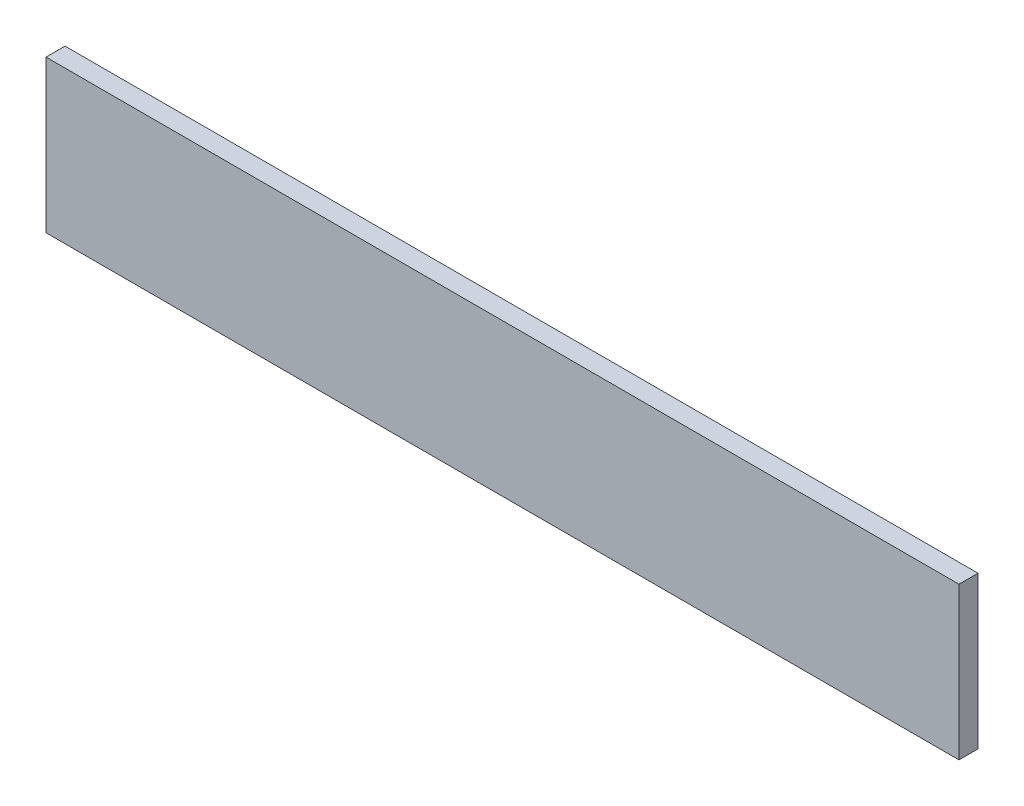
ISO-10303-21;
HEADER;
FILE_DESCRIPTION(('STEP AP214'),'2;1');
FILE_NAME('part.step','',(''),(''),'','','');
FILE_SCHEMA(('AUTOMOTIVE_DESIGN { 1 0 10303 214 1 1 1 1 }'));
ENDSEC;
DATA;
#1=APPLICATION_CONTEXT('core data for automotive mechanical design processes');
#2=APPLICATION_PROTOCOL_DEFINITION('international standard','automotive_design',2000,#1);
#3=PRODUCT_CONTEXT('',#1,'mechanical');
#4=PRODUCT('Part','Part','',(#3));
#5=PRODUCT_RELATED_PRODUCT_CATEGORY('part','',(#4));
#6=PRODUCT_DEFINITION_FORMATION('','',#4);
#7=PRODUCT_DEFINITION_CONTEXT('part definition',#1,'design');
#8=PRODUCT_DEFINITION('design','',#6,#7);
#9=PRODUCT_DEFINITION_SHAPE('','',#8);
#10=(LENGTH_UNIT() NAMED_UNIT(*) SI_UNIT(.MILLI.,.METRE.));
#11=(NAMED_UNIT(*) PLANE_ANGLE_UNIT() SI_UNIT($,.RADIAN.));
#12=(NAMED_UNIT(*) SI_UNIT($,.STERADIAN.) SOLID_ANGLE_UNIT());
#13=UNCERTAINTY_MEASURE_WITH_UNIT(LENGTH_MEASURE(1.E-05),#10,'distance_accuracy_value','');
#14=(GEOMETRIC_REPRESENTATION_CONTEXT(3) GLOBAL_UNCERTAINTY_ASSIGNED_CONTEXT((#13)) GLOBAL_UNIT_ASSIGNED_CONTEXT((#10,
#11,#12)) REPRESENTATION_CONTEXT('',''));
#15=CARTESIAN_POINT('',(0.,0.,0.));
#16=DIRECTION('',(0.,0.,1.));
#17=DIRECTION('',(1.,0.,0.));
#18=AXIS2_PLACEMENT_3D('',#15,#16,#17);
#19=CARTESIAN_POINT('',(240.,40.,10.));
#20=DIRECTION('',(-1.,0.,0.));
#21=DIRECTION('',(0.,-1.,0.));
#22=AXIS2_PLACEMENT_3D('',#19,#20,#21);
#23=PLANE('',#22);
#24=DIRECTION('',(0.,1.,0.));
#25=VECTOR('',#24,1.);
#26=CARTESIAN_POINT('',(240.,40.,0.));
#27=LINE('',#26,#25);
#28=CARTESIAN_POINT('',(240.,-40.,0.));
#29=VERTEX_POINT('',#28);
#30=CARTESIAN_POINT('',(240.,40.,0.));
#31=VERTEX_POINT('',#30);
#32=EDGE_CURVE('E107',#29,#31,#27,.T.);
#33=ORIENTED_EDGE('',*,*,#32,.T.);
#34=DIRECTION('',(0.,0.,-1.));
#35=VECTOR('',#34,1.);
#36=CARTESIAN_POINT('',(240.,40.,10.));
#37=LINE('',#36,#35);
#38=CARTESIAN_POINT('',(240.,40.,10.));
#39=VERTEX_POINT('',#38);
#40=EDGE_CURVE('E11',#39,#31,#37,.T.);
#41=ORIENTED_EDGE('',*,*,#40,.F.);
#42=DIRECTION('',(0.,1.,0.));
#43=VECTOR('',#42,1.);
#44=CARTESIAN_POINT('',(240.,40.,10.));
#45=LINE('',#44,#43);
#46=CARTESIAN_POINT('',(240.,-40.,10.));
#47=VERTEX_POINT('',#46);
#48=EDGE_CURVE('E91',#47,#39,#45,.T.);
#49=ORIENTED_EDGE('',*,*,#48,.F.);
#50=DIRECTION('',(0.,0.,-1.));
#51=VECTOR('',#50,1.);
#52=CARTESIAN_POINT('',(240.,-40.,10.));
#53=LINE('',#52,#51);
#54=EDGE_CURVE('E103',#47,#29,#53,.T.);
#55=ORIENTED_EDGE('',*,*,#54,.T.);
#56=EDGE_LOOP('',(#33,#41,#49,#55));
#57=FACE_BOUND('',#56,.T.);
#58=ADVANCED_FACE('F39',(#57),#23,.F.);
#59=CARTESIAN_POINT('',(-240.,39.9999999999997,10.));
#60=DIRECTION('',(0.,-1.,0.));
#61=DIRECTION('',(1.,0.,0.));
#62=AXIS2_PLACEMENT_3D('',#59,#60,#61);
#63=PLANE('',#62);
#64=DIRECTION('',(-1.,0.,0.));
#65=VECTOR('',#64,1.);
#66=CARTESIAN_POINT('',(-240.,39.9999999999997,0.));
#67=LINE('',#66,#65);
#68=CARTESIAN_POINT('',(-240.,39.9999999999997,0.));
#69=VERTEX_POINT('',#68);
#70=EDGE_CURVE('E96',#31,#69,#67,.T.);
#71=ORIENTED_EDGE('',*,*,#70,.T.);
#72=DIRECTION('',(0.,0.,-1.));
#73=VECTOR('',#72,1.);
#74=CARTESIAN_POINT('',(-240.,39.9999999999997,10.));
#75=LINE('',#74,#73);
#76=CARTESIAN_POINT('',(-240.,39.9999999999997,10.));
#77=VERTEX_POINT('',#76);
#78=EDGE_CURVE('E48',#77,#69,#75,.T.);
#79=ORIENTED_EDGE('',*,*,#78,.F.);
#80=DIRECTION('',(-1.,0.,0.));
#81=VECTOR('',#80,1.);
#82=CARTESIAN_POINT('',(-240.,39.9999999999997,10.));
#83=LINE('',#82,#81);
#84=EDGE_CURVE('E86',#39,#77,#83,.T.);
#85=ORIENTED_EDGE('',*,*,#84,.F.);
#86=ORIENTED_EDGE('',*,*,#40,.T.);
#87=EDGE_LOOP('',(#71,#79,#85,#86));
#88=FACE_BOUND('',#87,.T.);
#89=ADVANCED_FACE('F95',(#88),#63,.F.);
#90=CARTESIAN_POINT('',(-240.,39.9999999999997,10.));
#91=DIRECTION('',(1.,0.,0.));
#92=DIRECTION('',(0.,1.,0.));
#93=AXIS2_PLACEMENT_3D('',#90,#91,#92);
#94=PLANE('',#93);
#95=DIRECTION('',(0.,-1.,0.));
#96=VECTOR('',#95,1.);
#97=CARTESIAN_POINT('',(-240.,39.9999999999997,0.));
#98=LINE('',#97,#96);
#99=CARTESIAN_POINT('',(-240.,-40.,0.));
#100=VERTEX_POINT('',#99);
#101=EDGE_CURVE('E73',#69,#100,#98,.T.);
#102=ORIENTED_EDGE('',*,*,#101,.T.);
#103=DIRECTION('',(0.,0.,-1.));
#104=VECTOR('',#103,1.);
#105=CARTESIAN_POINT('',(-240.,-40.,10.));
#106=LINE('',#105,#104);
#107=CARTESIAN_POINT('',(-240.,-40.,10.));
#108=VERTEX_POINT('',#107);
#109=EDGE_CURVE('E98',#108,#100,#106,.T.);
#110=ORIENTED_EDGE('',*,*,#109,.F.);
#111=DIRECTION('',(0.,-1.,0.));
#112=VECTOR('',#111,1.);
#113=CARTESIAN_POINT('',(-240.,39.9999999999997,10.));
#114=LINE('',#113,#112);
#115=EDGE_CURVE('E89',#77,#108,#114,.T.);
#116=ORIENTED_EDGE('',*,*,#115,.F.);
#117=ORIENTED_EDGE('',*,*,#78,.T.);
#118=EDGE_LOOP('',(#102,#110,#116,#117));
#119=FACE_BOUND('',#118,.T.);
#120=ADVANCED_FACE('F99',(#119),#94,.F.);
#121=CARTESIAN_POINT('',(-240.,-40.,10.));
#122=DIRECTION('',(0.,1.,0.));
#123=DIRECTION('',(0.,0.,1.));
#124=AXIS2_PLACEMENT_3D('',#121,#122,#123);
#125=PLANE('',#124);
#126=DIRECTION('',(1.,0.,0.));
#127=VECTOR('',#126,1.);
#128=CARTESIAN_POINT('',(-240.,-40.,0.));
#129=LINE('',#128,#127);
#130=EDGE_CURVE('E79',#100,#29,#129,.T.);
#131=ORIENTED_EDGE('',*,*,#130,.T.);
#132=ORIENTED_EDGE('',*,*,#54,.F.);
#133=DIRECTION('',(1.,0.,0.));
#134=VECTOR('',#133,1.);
#135=CARTESIAN_POINT('',(-240.,-40.,10.));
#136=LINE('',#135,#134);
#137=EDGE_CURVE('E56',#108,#47,#136,.T.);
#138=ORIENTED_EDGE('',*,*,#137,.F.);
#139=ORIENTED_EDGE('',*,*,#109,.T.);
#140=EDGE_LOOP('',(#131,#132,#138,#139));
#141=FACE_BOUND('',#140,.T.);
#142=ADVANCED_FACE('F120',(#141),#125,.F.);
#143=CARTESIAN_POINT('',(0.,0.,10.));
#144=DIRECTION('',(0.,0.,1.));
#145=DIRECTION('',(1.,0.,0.));
#146=AXIS2_PLACEMENT_3D('',#143,#144,#145);
#147=PLANE('',#146);
#148=ORIENTED_EDGE('',*,*,#48,.T.);
#149=ORIENTED_EDGE('',*,*,#84,.T.);
#150=ORIENTED_EDGE('',*,*,#115,.T.);
#151=ORIENTED_EDGE('',*,*,#137,.T.);
#152=EDGE_LOOP('',(#148,#149,#150,#151));
#153=FACE_BOUND('',#152,.T.);
#154=ADVANCED_FACE('F87',(#153),#147,.T.);
#155=CARTESIAN_POINT('',(0.,0.,0.));
#156=DIRECTION('',(0.,0.,1.));
#157=DIRECTION('',(1.,0.,0.));
#158=AXIS2_PLACEMENT_3D('',#155,#156,#157);
#159=PLANE('',#158);
#160=ORIENTED_EDGE('',*,*,#32,.F.);
#161=ORIENTED_EDGE('',*,*,#130,.F.);
#162=ORIENTED_EDGE('',*,*,#101,.F.);
#163=ORIENTED_EDGE('',*,*,#70,.F.);
#164=EDGE_LOOP('',(#160,#161,#162,#163));
#165=FACE_BOUND('',#164,.T.);
#166=ADVANCED_FACE('F123',(#165),#159,.F.);
#167=CLOSED_SHELL('',(#58,#89,#120,#142,#154,#166));
#168=MANIFOLD_SOLID_BREP('B2',#167);
#169=ADVANCED_BREP_SHAPE_REPRESENTATION('',(#18,#168),#14);
#170=SHAPE_DEFINITION_REPRESENTATION(#9,#169);
ENDSEC;
END-ISO-10303-21;
